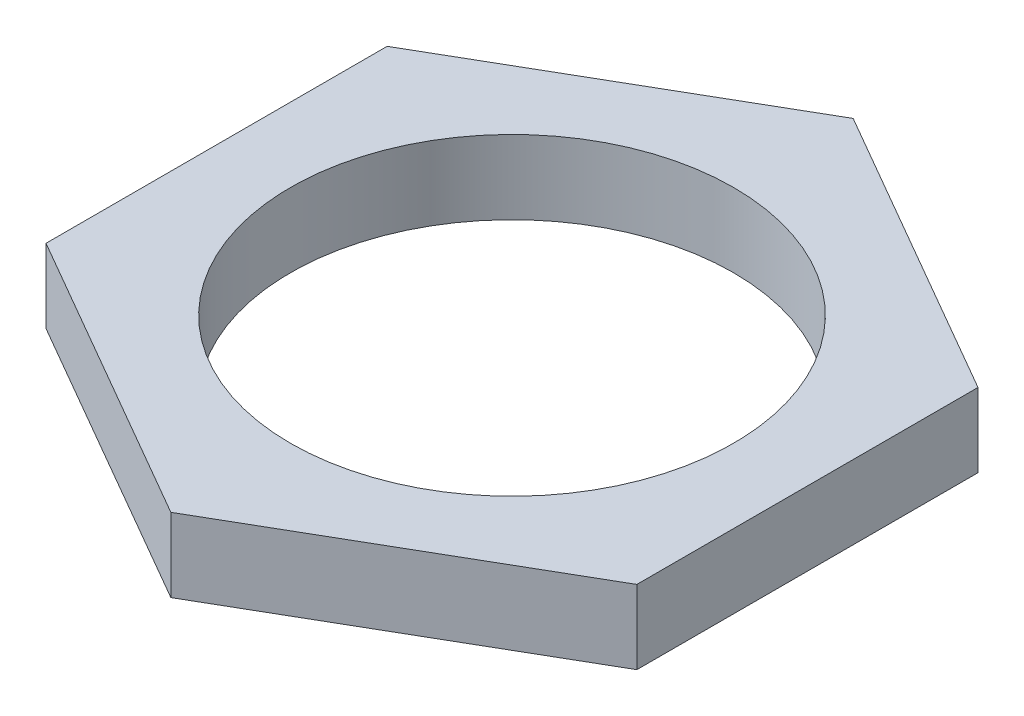
ISO-10303-21;
HEADER;
FILE_DESCRIPTION(('STEP AP214'),'2;1');
FILE_NAME('part.step','',(''),(''),'','','');
FILE_SCHEMA(('AUTOMOTIVE_DESIGN { 1 0 10303 214 1 1 1 1 }'));
ENDSEC;
DATA;
#1=APPLICATION_CONTEXT('core data for automotive mechanical design processes');
#2=APPLICATION_PROTOCOL_DEFINITION('international standard','automotive_design',2000,#1);
#3=PRODUCT_CONTEXT('',#1,'mechanical');
#4=PRODUCT('Part','Part','',(#3));
#5=PRODUCT_RELATED_PRODUCT_CATEGORY('part','',(#4));
#6=PRODUCT_DEFINITION_FORMATION('','',#4);
#7=PRODUCT_DEFINITION_CONTEXT('part definition',#1,'design');
#8=PRODUCT_DEFINITION('design','',#6,#7);
#9=PRODUCT_DEFINITION_SHAPE('','',#8);
#10=(LENGTH_UNIT() NAMED_UNIT(*) SI_UNIT(.MILLI.,.METRE.));
#11=(NAMED_UNIT(*) PLANE_ANGLE_UNIT() SI_UNIT($,.RADIAN.));
#12=(NAMED_UNIT(*) SI_UNIT($,.STERADIAN.) SOLID_ANGLE_UNIT());
#13=UNCERTAINTY_MEASURE_WITH_UNIT(LENGTH_MEASURE(1.E-05),#10,'distance_accuracy_value','');
#14=(GEOMETRIC_REPRESENTATION_CONTEXT(3) GLOBAL_UNCERTAINTY_ASSIGNED_CONTEXT((#13)) GLOBAL_UNIT_ASSIGNED_CONTEXT((#10,
#11,#12)) REPRESENTATION_CONTEXT('',''));
#15=CARTESIAN_POINT('',(0.,0.,0.));
#16=DIRECTION('',(0.,0.,1.));
#17=DIRECTION('',(1.,0.,0.));
#18=AXIS2_PLACEMENT_3D('',#15,#16,#17);
#19=CARTESIAN_POINT('',(3.99999999999997,1.,-2.30940107675855));
#20=DIRECTION('',(-0.499999999999995,0.,0.866025403784442));
#21=DIRECTION('',(0.866025403784442,0.,0.499999999999995));
#22=AXIS2_PLACEMENT_3D('',#19,#20,#21);
#23=PLANE('',#22);
#24=DIRECTION('',(-0.866025403784442,0.,-0.499999999999995));
#25=VECTOR('',#24,1.);
#26=CARTESIAN_POINT('',(3.99999999999997,0.,-2.30940107675855));
#27=LINE('',#26,#25);
#28=CARTESIAN_POINT('',(3.99999999999997,0.,-2.30940107675855));
#29=VERTEX_POINT('',#28);
#30=CARTESIAN_POINT('',(0.,0.,-4.618802153517));
#31=VERTEX_POINT('',#30);
#32=EDGE_CURVE('E117',#29,#31,#27,.T.);
#33=ORIENTED_EDGE('',*,*,#32,.T.);
#34=DIRECTION('',(0.,-1.,0.));
#35=VECTOR('',#34,1.);
#36=CARTESIAN_POINT('',(0.,1.,-4.618802153517));
#37=LINE('',#36,#35);
#38=CARTESIAN_POINT('',(0.,1.,-4.618802153517));
#39=VERTEX_POINT('',#38);
#40=EDGE_CURVE('E11',#39,#31,#37,.T.);
#41=ORIENTED_EDGE('',*,*,#40,.F.);
#42=DIRECTION('',(-0.866025403784442,0.,-0.499999999999995));
#43=VECTOR('',#42,1.);
#44=CARTESIAN_POINT('',(3.99999999999997,1.,-2.30940107675855));
#45=LINE('',#44,#43);
#46=CARTESIAN_POINT('',(3.99999999999997,1.,-2.30940107675855));
#47=VERTEX_POINT('',#46);
#48=EDGE_CURVE('E128',#47,#39,#45,.T.);
#49=ORIENTED_EDGE('',*,*,#48,.F.);
#50=DIRECTION('',(0.,-1.,0.));
#51=VECTOR('',#50,1.);
#52=CARTESIAN_POINT('',(3.99999999999997,1.,-2.30940107675855));
#53=LINE('',#52,#51);
#54=EDGE_CURVE('E113',#47,#29,#53,.T.);
#55=ORIENTED_EDGE('',*,*,#54,.T.);
#56=EDGE_LOOP('',(#33,#41,#49,#55));
#57=FACE_BOUND('',#56,.T.);
#58=ADVANCED_FACE('F33',(#57),#23,.F.);
#59=CARTESIAN_POINT('',(0.,1.,-4.618802153517));
#60=DIRECTION('',(0.500000000000001,0.,0.866025403784438));
#61=DIRECTION('',(0.866025403784438,0.,-0.500000000000001));
#62=AXIS2_PLACEMENT_3D('',#59,#60,#61);
#63=PLANE('',#62);
#64=DIRECTION('',(-0.866025403784438,0.,0.500000000000001));
#65=VECTOR('',#64,1.);
#66=CARTESIAN_POINT('',(0.,0.,-4.618802153517));
#67=LINE('',#66,#65);
#68=CARTESIAN_POINT('',(-4.,0.,-2.30940107675849));
#69=VERTEX_POINT('',#68);
#70=EDGE_CURVE('E120',#31,#69,#67,.T.);
#71=ORIENTED_EDGE('',*,*,#70,.T.);
#72=DIRECTION('',(0.,-1.,0.));
#73=VECTOR('',#72,1.);
#74=CARTESIAN_POINT('',(-4.,1.,-2.30940107675849));
#75=LINE('',#74,#73);
#76=CARTESIAN_POINT('',(-4.,1.,-2.30940107675849));
#77=VERTEX_POINT('',#76);
#78=EDGE_CURVE('E41',#77,#69,#75,.T.);
#79=ORIENTED_EDGE('',*,*,#78,.F.);
#80=DIRECTION('',(-0.866025403784438,0.,0.500000000000001));
#81=VECTOR('',#80,1.);
#82=CARTESIAN_POINT('',(0.,1.,-4.618802153517));
#83=LINE('',#82,#81);
#84=EDGE_CURVE('E86',#39,#77,#83,.T.);
#85=ORIENTED_EDGE('',*,*,#84,.F.);
#86=ORIENTED_EDGE('',*,*,#40,.T.);
#87=EDGE_LOOP('',(#71,#79,#85,#86));
#88=FACE_BOUND('',#87,.T.);
#89=ADVANCED_FACE('F153',(#88),#63,.F.);
#90=CARTESIAN_POINT('',(-4.,1.,-2.30940107675849));
#91=DIRECTION('',(1.,0.,0.));
#92=DIRECTION('',(0.,0.,-1.));
#93=AXIS2_PLACEMENT_3D('',#90,#91,#92);
#94=PLANE('',#93);
#95=DIRECTION('',(0.,0.,1.));
#96=VECTOR('',#95,1.);
#97=CARTESIAN_POINT('',(-4.,0.,-2.30940107675849));
#98=LINE('',#97,#96);
#99=CARTESIAN_POINT('',(-3.99999999999998,0.,2.30940107675852));
#100=VERTEX_POINT('',#99);
#101=EDGE_CURVE('E123',#69,#100,#98,.T.);
#102=ORIENTED_EDGE('',*,*,#101,.T.);
#103=DIRECTION('',(0.,-1.,0.));
#104=VECTOR('',#103,1.);
#105=CARTESIAN_POINT('',(-3.99999999999998,1.,2.30940107675852));
#106=LINE('',#105,#104);
#107=CARTESIAN_POINT('',(-3.99999999999998,1.,2.30940107675852));
#108=VERTEX_POINT('',#107);
#109=EDGE_CURVE('E108',#108,#100,#106,.T.);
#110=ORIENTED_EDGE('',*,*,#109,.F.);
#111=DIRECTION('',(0.,0.,1.));
#112=VECTOR('',#111,1.);
#113=CARTESIAN_POINT('',(-4.,1.,-2.30940107675849));
#114=LINE('',#113,#112);
#115=EDGE_CURVE('E99',#77,#108,#114,.T.);
#116=ORIENTED_EDGE('',*,*,#115,.F.);
#117=ORIENTED_EDGE('',*,*,#78,.T.);
#118=EDGE_LOOP('',(#102,#110,#116,#117));
#119=FACE_BOUND('',#118,.T.);
#120=ADVANCED_FACE('F134',(#119),#94,.F.);
#121=CARTESIAN_POINT('',(-3.99999999999998,1.,2.30940107675852));
#122=DIRECTION('',(0.499999999999995,0.,-0.866025403784441));
#123=DIRECTION('',(-0.866025403784441,0.,-0.499999999999995));
#124=AXIS2_PLACEMENT_3D('',#121,#122,#123);
#125=PLANE('',#124);
#126=DIRECTION('',(0.866025403784441,0.,0.499999999999995));
#127=VECTOR('',#126,1.);
#128=CARTESIAN_POINT('',(-3.99999999999998,0.,2.30940107675852));
#129=LINE('',#128,#127);
#130=CARTESIAN_POINT('',(0.,0.,4.618802153517));
#131=VERTEX_POINT('',#130);
#132=EDGE_CURVE('E107',#100,#131,#129,.T.);
#133=ORIENTED_EDGE('',*,*,#132,.T.);
#134=DIRECTION('',(0.,-1.,0.));
#135=VECTOR('',#134,1.);
#136=CARTESIAN_POINT('',(0.,1.,4.618802153517));
#137=LINE('',#136,#135);
#138=CARTESIAN_POINT('',(0.,1.,4.618802153517));
#139=VERTEX_POINT('',#138);
#140=EDGE_CURVE('E104',#139,#131,#137,.T.);
#141=ORIENTED_EDGE('',*,*,#140,.F.);
#142=DIRECTION('',(0.866025403784441,0.,0.499999999999995));
#143=VECTOR('',#142,1.);
#144=CARTESIAN_POINT('',(-3.99999999999998,1.,2.30940107675852));
#145=LINE('',#144,#143);
#146=EDGE_CURVE('E93',#108,#139,#145,.T.);
#147=ORIENTED_EDGE('',*,*,#146,.F.);
#148=ORIENTED_EDGE('',*,*,#109,.T.);
#149=EDGE_LOOP('',(#133,#141,#147,#148));
#150=FACE_BOUND('',#149,.T.);
#151=ADVANCED_FACE('F105',(#150),#125,.F.);
#152=CARTESIAN_POINT('',(0.,1.,4.618802153517));
#153=DIRECTION('',(-0.500000000000007,0.,-0.866025403784435));
#154=DIRECTION('',(-0.866025403784435,0.,0.500000000000007));
#155=AXIS2_PLACEMENT_3D('',#152,#153,#154);
#156=PLANE('',#155);
#157=DIRECTION('',(0.866025403784435,0.,-0.500000000000007));
#158=VECTOR('',#157,1.);
#159=CARTESIAN_POINT('',(0.,0.,4.618802153517));
#160=LINE('',#159,#158);
#161=CARTESIAN_POINT('',(4.00000000000002,0.,2.30940107675846));
#162=VERTEX_POINT('',#161);
#163=EDGE_CURVE('E72',#131,#162,#160,.T.);
#164=ORIENTED_EDGE('',*,*,#163,.T.);
#165=DIRECTION('',(0.,-1.,0.));
#166=VECTOR('',#165,1.);
#167=CARTESIAN_POINT('',(4.00000000000002,1.,2.30940107675846));
#168=LINE('',#167,#166);
#169=CARTESIAN_POINT('',(4.00000000000002,1.,2.30940107675846));
#170=VERTEX_POINT('',#169);
#171=EDGE_CURVE('E109',#170,#162,#168,.T.);
#172=ORIENTED_EDGE('',*,*,#171,.F.);
#173=DIRECTION('',(0.866025403784435,0.,-0.500000000000007));
#174=VECTOR('',#173,1.);
#175=CARTESIAN_POINT('',(0.,1.,4.618802153517));
#176=LINE('',#175,#174);
#177=EDGE_CURVE('E97',#139,#170,#176,.T.);
#178=ORIENTED_EDGE('',*,*,#177,.F.);
#179=ORIENTED_EDGE('',*,*,#140,.T.);
#180=EDGE_LOOP('',(#164,#172,#178,#179));
#181=FACE_BOUND('',#180,.T.);
#182=ADVANCED_FACE('F111',(#181),#156,.F.);
#183=CARTESIAN_POINT('',(4.00000000000002,1.,2.30940107675846));
#184=DIRECTION('',(-1.,0.,0.));
#185=DIRECTION('',(0.,0.,1.));
#186=AXIS2_PLACEMENT_3D('',#183,#184,#185);
#187=PLANE('',#186);
#188=DIRECTION('',(0.,0.,-1.));
#189=VECTOR('',#188,1.);
#190=CARTESIAN_POINT('',(4.00000000000002,0.,2.30940107675846));
#191=LINE('',#190,#189);
#192=EDGE_CURVE('E78',#162,#29,#191,.T.);
#193=ORIENTED_EDGE('',*,*,#192,.T.);
#194=ORIENTED_EDGE('',*,*,#54,.F.);
#195=DIRECTION('',(0.,0.,-1.));
#196=VECTOR('',#195,1.);
#197=CARTESIAN_POINT('',(4.00000000000002,1.,2.30940107675846));
#198=LINE('',#197,#196);
#199=EDGE_CURVE('E49',#170,#47,#198,.T.);
#200=ORIENTED_EDGE('',*,*,#199,.F.);
#201=ORIENTED_EDGE('',*,*,#171,.T.);
#202=EDGE_LOOP('',(#193,#194,#200,#201));
#203=FACE_BOUND('',#202,.T.);
#204=ADVANCED_FACE('F141',(#203),#187,.F.);
#205=CARTESIAN_POINT('',(0.,1.,0.));
#206=DIRECTION('',(0.,1.,0.));
#207=DIRECTION('',(0.,0.,1.));
#208=AXIS2_PLACEMENT_3D('',#205,#206,#207);
#209=PLANE('',#208);
#210=CARTESIAN_POINT('',(0.,1.,0.));
#211=DIRECTION('',(0.,1.,0.));
#212=DIRECTION('',(0.,0.,1.));
#213=AXIS2_PLACEMENT_3D('',#210,#211,#212);
#214=CIRCLE('',#213,3.);
#215=CARTESIAN_POINT('',(0.,1.,3.));
#216=VERTEX_POINT('',#215);
#217=EDGE_CURVE('E206',#216,#216,#214,.T.);
#218=ORIENTED_EDGE('',*,*,#217,.F.);
#219=EDGE_LOOP('',(#218));
#220=FACE_BOUND('',#219,.T.);
#221=ORIENTED_EDGE('',*,*,#48,.T.);
#222=ORIENTED_EDGE('',*,*,#84,.T.);
#223=ORIENTED_EDGE('',*,*,#115,.T.);
#224=ORIENTED_EDGE('',*,*,#146,.T.);
#225=ORIENTED_EDGE('',*,*,#177,.T.);
#226=ORIENTED_EDGE('',*,*,#199,.T.);
#227=EDGE_LOOP('',(#221,#222,#223,#224,#225,#226));
#228=FACE_BOUND('',#227,.T.);
#229=ADVANCED_FACE('F95',(#220,#228),#209,.T.);
#230=CARTESIAN_POINT('',(0.,0.,0.));
#231=DIRECTION('',(0.,1.,0.));
#232=DIRECTION('',(0.,0.,1.));
#233=AXIS2_PLACEMENT_3D('',#230,#231,#232);
#234=PLANE('',#233);
#235=CARTESIAN_POINT('',(0.,0.,0.));
#236=DIRECTION('',(0.,1.,0.));
#237=DIRECTION('',(0.,0.,1.));
#238=AXIS2_PLACEMENT_3D('',#235,#236,#237);
#239=CIRCLE('',#238,3.);
#240=CARTESIAN_POINT('',(0.,0.,3.));
#241=VERTEX_POINT('',#240);
#242=EDGE_CURVE('E121',#241,#241,#239,.F.);
#243=ORIENTED_EDGE('',*,*,#242,.F.);
#244=EDGE_LOOP('',(#243));
#245=FACE_BOUND('',#244,.T.);
#246=ORIENTED_EDGE('',*,*,#32,.F.);
#247=ORIENTED_EDGE('',*,*,#192,.F.);
#248=ORIENTED_EDGE('',*,*,#163,.F.);
#249=ORIENTED_EDGE('',*,*,#132,.F.);
#250=ORIENTED_EDGE('',*,*,#101,.F.);
#251=ORIENTED_EDGE('',*,*,#70,.F.);
#252=EDGE_LOOP('',(#246,#247,#248,#249,#250,#251));
#253=FACE_BOUND('',#252,.T.);
#254=ADVANCED_FACE('F137',(#245,#253),#234,.F.);
#255=CARTESIAN_POINT('',(0.,-0.000999999999999916,0.));
#256=DIRECTION('',(0.,1.,0.));
#257=DIRECTION('',(0.,0.,1.));
#258=AXIS2_PLACEMENT_3D('',#255,#256,#257);
#259=CYLINDRICAL_SURFACE('',#258,3.);
#260=ORIENTED_EDGE('',*,*,#217,.T.);
#261=EDGE_LOOP('',(#260));
#262=FACE_BOUND('',#261,.T.);
#263=ORIENTED_EDGE('',*,*,#242,.T.);
#264=EDGE_LOOP('',(#263));
#265=FACE_BOUND('',#264,.T.);
#266=ADVANCED_FACE('F190',(#262,#265),#259,.F.);
#267=CLOSED_SHELL('',(#58,#89,#120,#151,#182,#204,#229,#254,#266));
#268=MANIFOLD_SOLID_BREP('B2',#267);
#269=ADVANCED_BREP_SHAPE_REPRESENTATION('',(#18,#268),#14);
#270=SHAPE_DEFINITION_REPRESENTATION(#9,#269);
ENDSEC;
END-ISO-10303-21;
